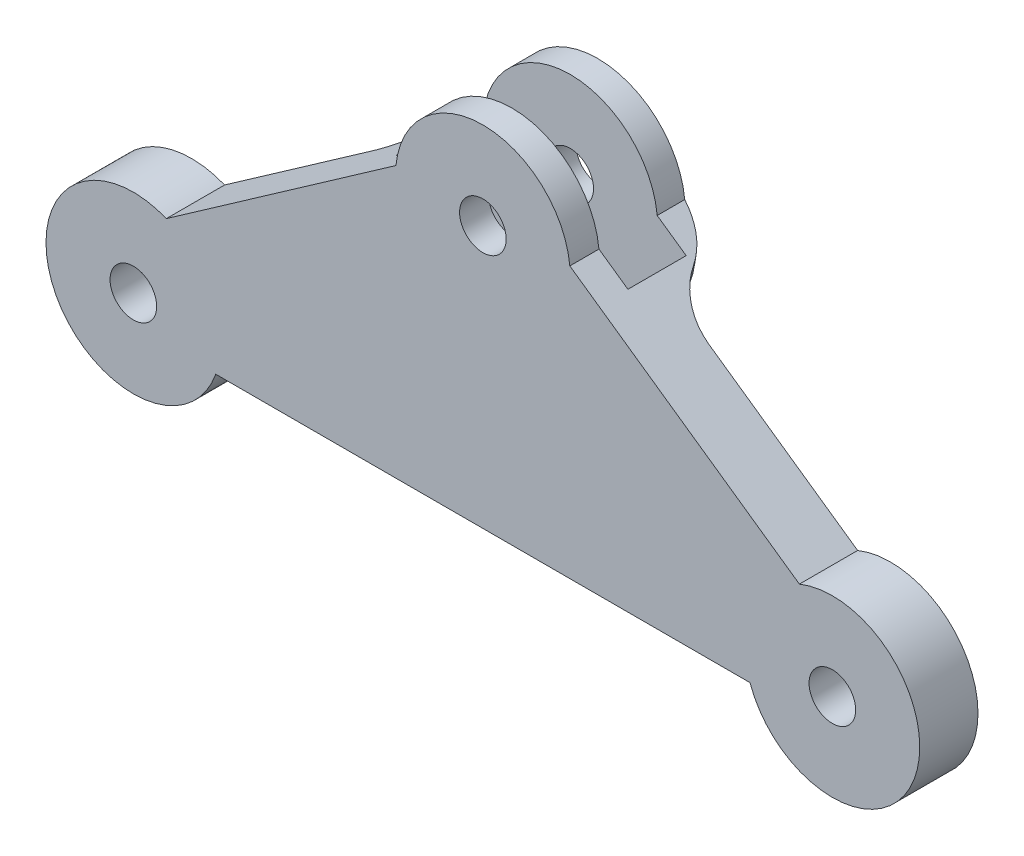
ISO-10303-21;
HEADER;
FILE_DESCRIPTION(('STEP AP214'),'2;1');
FILE_NAME('part.step','',(''),(''),'','','');
FILE_SCHEMA(('AUTOMOTIVE_DESIGN { 1 0 10303 214 1 1 1 1 }'));
ENDSEC;
DATA;
#1=APPLICATION_CONTEXT('core data for automotive mechanical design processes');
#2=APPLICATION_PROTOCOL_DEFINITION('international standard','automotive_design',2000,#1);
#3=PRODUCT_CONTEXT('',#1,'mechanical');
#4=PRODUCT('Part','Part','',(#3));
#5=PRODUCT_RELATED_PRODUCT_CATEGORY('part','',(#4));
#6=PRODUCT_DEFINITION_FORMATION('','',#4);
#7=PRODUCT_DEFINITION_CONTEXT('part definition',#1,'design');
#8=PRODUCT_DEFINITION('design','',#6,#7);
#9=PRODUCT_DEFINITION_SHAPE('','',#8);
#10=(LENGTH_UNIT() NAMED_UNIT(*) SI_UNIT(.MILLI.,.METRE.));
#11=(NAMED_UNIT(*) PLANE_ANGLE_UNIT() SI_UNIT($,.RADIAN.));
#12=(NAMED_UNIT(*) SI_UNIT($,.STERADIAN.) SOLID_ANGLE_UNIT());
#13=UNCERTAINTY_MEASURE_WITH_UNIT(LENGTH_MEASURE(1.E-05),#10,'distance_accuracy_value','');
#14=(GEOMETRIC_REPRESENTATION_CONTEXT(3) GLOBAL_UNCERTAINTY_ASSIGNED_CONTEXT((#13)) GLOBAL_UNIT_ASSIGNED_CONTEXT((#10,
#11,#12)) REPRESENTATION_CONTEXT('',''));
#15=CARTESIAN_POINT('',(0.,0.,0.));
#16=DIRECTION('',(0.,0.,1.));
#17=DIRECTION('',(1.,0.,0.));
#18=AXIS2_PLACEMENT_3D('',#15,#16,#17);
#19=CARTESIAN_POINT('',(60.0000001203415,29.2959686390319,17.627987333967));
#20=DIRECTION('',(0.,0.,-1.));
#21=DIRECTION('',(-1.00000000000001,0.,0.));
#22=AXIS2_PLACEMENT_3D('',#19,#20,#21);
#23=CYLINDRICAL_SURFACE('',#22,9.00000000000001);
#24=CARTESIAN_POINT('',(60.0000001203415,29.2959686390319,8.62798733396714));
#25=DIRECTION('',(0.,0.,1.));
#26=DIRECTION('',(1.00000000000001,0.,0.));
#27=AXIS2_PLACEMENT_3D('',#24,#25,#26);
#28=CIRCLE('',#27,9.00000000000001);
#29=CARTESIAN_POINT('',(68.9555880693523,30.1889661124638,8.62798733396714));
#30=VERTEX_POINT('',#29);
#31=CARTESIAN_POINT('',(51.044412171332,30.1889661124641,8.62798733396714));
#32=VERTEX_POINT('',#31);
#33=EDGE_CURVE('E135',#30,#32,#28,.T.);
#34=ORIENTED_EDGE('',*,*,#33,.F.);
#35=DIRECTION('',(0.,0.,-1.));
#36=VECTOR('',#35,1.);
#37=CARTESIAN_POINT('',(68.9555880693523,30.1889661124638,17.6279873339671));
#38=LINE('',#37,#36);
#39=CARTESIAN_POINT('',(68.9555880693523,30.1889661124638,5.79176533532464));
#40=VERTEX_POINT('',#39);
#41=EDGE_CURVE('E214',#30,#40,#38,.T.);
#42=ORIENTED_EDGE('',*,*,#41,.T.);
#43=CARTESIAN_POINT('',(60.0000001203414,29.2959686390319,5.79176533532464));
#44=DIRECTION('',(0.,0.,1.));
#45=DIRECTION('',(1.00000000000001,0.,0.));
#46=AXIS2_PLACEMENT_3D('',#43,#44,#45);
#47=CIRCLE('',#46,9.00000000000001);
#48=CARTESIAN_POINT('',(51.044412171332,30.1889661124641,5.79176533532463));
#49=VERTEX_POINT('',#48);
#50=EDGE_CURVE('E277',#40,#49,#47,.T.);
#51=ORIENTED_EDGE('',*,*,#50,.T.);
#52=DIRECTION('',(0.,0.,-1.));
#53=VECTOR('',#52,1.);
#54=CARTESIAN_POINT('',(51.044412171332,30.1889661124641,17.6279873339671));
#55=LINE('',#54,#53);
#56=EDGE_CURVE('E212',#32,#49,#55,.T.);
#57=ORIENTED_EDGE('',*,*,#56,.F.);
#58=EDGE_LOOP('',(#34,#42,#51,#57));
#59=FACE_BOUND('',#58,.T.);
#60=ADVANCED_FACE('F41',(#59),#23,.T.);
#61=CARTESIAN_POINT('',(60.0000001203415,29.2959686390319,17.627987333967));
#62=DIRECTION('',(0.,0.,-1.));
#63=DIRECTION('',(-1.00000000000001,0.,0.));
#64=AXIS2_PLACEMENT_3D('',#61,#62,#63);
#65=CYLINDRICAL_SURFACE('',#64,2.40000000000001);
#66=CARTESIAN_POINT('',(60.0000001203415,29.2959686390319,5.62798733396714));
#67=DIRECTION('',(0.,0.,1.));
#68=DIRECTION('',(1.00000000000001,0.,0.));
#69=AXIS2_PLACEMENT_3D('',#66,#67,#68);
#70=CIRCLE('',#69,2.40000000000001);
#71=CARTESIAN_POINT('',(62.4000001203415,29.2959686390319,5.62798733396714));
#72=VERTEX_POINT('',#71);
#73=EDGE_CURVE('E190',#72,#72,#70,.T.);
#74=ORIENTED_EDGE('',*,*,#73,.F.);
#75=EDGE_LOOP('',(#74));
#76=FACE_BOUND('',#75,.T.);
#77=CARTESIAN_POINT('',(60.0000001203415,29.2959686390319,8.62798733396714));
#78=DIRECTION('',(0.,0.,1.));
#79=DIRECTION('',(1.00000000000001,0.,0.));
#80=AXIS2_PLACEMENT_3D('',#77,#78,#79);
#81=CIRCLE('',#80,2.40000000000001);
#82=CARTESIAN_POINT('',(62.4000001203415,29.2959686390319,8.62798733396714));
#83=VERTEX_POINT('',#82);
#84=EDGE_CURVE('E285',#83,#83,#81,.T.);
#85=ORIENTED_EDGE('',*,*,#84,.T.);
#86=EDGE_LOOP('',(#85));
#87=FACE_BOUND('',#86,.T.);
#88=ADVANCED_FACE('F335',(#76,#87),#65,.F.);
#89=CARTESIAN_POINT('',(24.0000001203415,5.29596863903185,5.62798733396714));
#90=DIRECTION('',(0.,0.,1.));
#91=DIRECTION('',(1.00000000000001,0.,0.));
#92=AXIS2_PLACEMENT_3D('',#89,#90,#91);
#93=PLANE('',#92);
#94=CARTESIAN_POINT('',(60.0000001203414,29.2959686390319,5.62798733396714));
#95=DIRECTION('',(0.,0.,1.));
#96=DIRECTION('',(1.00000000000001,0.,0.));
#97=AXIS2_PLACEMENT_3D('',#94,#95,#96);
#98=CIRCLE('',#97,7.60769515458674);
#99=CARTESIAN_POINT('',(67.5387156989998,28.2738174812985,5.62798733396714));
#100=VERTEX_POINT('',#99);
#101=EDGE_CURVE('E63',#100,#100,#98,.F.);
#102=ORIENTED_EDGE('',*,*,#101,.T.);
#103=EDGE_LOOP('',(#102));
#104=FACE_BOUND('',#103,.T.);
#105=ORIENTED_EDGE('',*,*,#73,.T.);
#106=EDGE_LOOP('',(#105));
#107=FACE_BOUND('',#106,.T.);
#108=ADVANCED_FACE('F255',(#104,#107),#93,.F.);
#109=CARTESIAN_POINT('',(24.0000001203415,5.29596863903185,17.6279873339671));
#110=DIRECTION('',(0.,0.,-1.));
#111=DIRECTION('',(-1.00000000000001,0.,0.));
#112=AXIS2_PLACEMENT_3D('',#109,#110,#111);
#113=CYLINDRICAL_SURFACE('',#112,9.00000000000003);
#114=CARTESIAN_POINT('',(24.0000001203415,5.29596863903185,11.6279873339671));
#115=DIRECTION('',(0.,0.,-1.));
#116=DIRECTION('',(-1.00000000000001,0.,0.));
#117=AXIS2_PLACEMENT_3D('',#114,#115,#116);
#118=CIRCLE('',#117,9.00000000000003);
#119=CARTESIAN_POINT('',(32.4852814945787,2.29596863903166,11.6279873339671));
#120=VERTEX_POINT('',#119);
#121=CARTESIAN_POINT('',(27.3964483552936,13.6304835851628,11.6279873339671));
#122=VERTEX_POINT('',#121);
#123=EDGE_CURVE('E173',#120,#122,#118,.T.);
#124=ORIENTED_EDGE('',*,*,#123,.F.);
#125=DIRECTION('',(0.,0.,-1.));
#126=VECTOR('',#125,1.);
#127=CARTESIAN_POINT('',(32.4852814945787,2.29596863903166,17.627987333967));
#128=LINE('',#127,#126);
#129=CARTESIAN_POINT('',(32.4852814945787,2.29596863903166,17.627987333967));
#130=VERTEX_POINT('',#129);
#131=EDGE_CURVE('E224',#130,#120,#128,.T.);
#132=ORIENTED_EDGE('',*,*,#131,.F.);
#133=CARTESIAN_POINT('',(24.0000001203415,5.29596863903185,17.6279873339671));
#134=DIRECTION('',(0.,0.,1.));
#135=DIRECTION('',(1.00000000000001,0.,0.));
#136=AXIS2_PLACEMENT_3D('',#133,#134,#135);
#137=CIRCLE('',#136,9.00000000000003);
#138=CARTESIAN_POINT('',(27.3964483552936,13.6304835851628,17.627987333967));
#139=VERTEX_POINT('',#138);
#140=EDGE_CURVE('E194',#139,#130,#137,.T.);
#141=ORIENTED_EDGE('',*,*,#140,.F.);
#142=DIRECTION('',(0.,0.,-1.));
#143=VECTOR('',#142,1.);
#144=CARTESIAN_POINT('',(27.3964483552936,13.6304835851628,17.627987333967));
#145=LINE('',#144,#143);
#146=EDGE_CURVE('E209',#139,#122,#145,.T.);
#147=ORIENTED_EDGE('',*,*,#146,.T.);
#148=EDGE_LOOP('',(#124,#132,#141,#147));
#149=FACE_BOUND('',#148,.T.);
#150=ADVANCED_FACE('F250',(#149),#113,.T.);
#151=CARTESIAN_POINT('',(87.5147187461029,2.29596863903184,17.6279873339671));
#152=DIRECTION('',(0.,1.00000000000001,0.));
#153=DIRECTION('',(-1.00000000000001,0.,0.));
#154=AXIS2_PLACEMENT_3D('',#151,#152,#153);
#155=PLANE('',#154);
#156=DIRECTION('',(-1.00000000000001,0.,0.));
#157=VECTOR('',#156,1.);
#158=CARTESIAN_POINT('',(24.0000001203401,2.29596863903184,11.6279873339671));
#159=LINE('',#158,#157);
#160=CARTESIAN_POINT('',(87.5147187461029,2.29596863903184,11.6279873339671));
#161=VERTEX_POINT('',#160);
#162=EDGE_CURVE('E171',#161,#120,#159,.T.);
#163=ORIENTED_EDGE('',*,*,#162,.F.);
#164=DIRECTION('',(0.,0.,-1.));
#165=VECTOR('',#164,1.);
#166=CARTESIAN_POINT('',(87.5147187461029,2.29596863903184,17.6279873339671));
#167=LINE('',#166,#165);
#168=CARTESIAN_POINT('',(87.5147187461029,2.29596863903184,17.6279873339671));
#169=VERTEX_POINT('',#168);
#170=EDGE_CURVE('E221',#169,#161,#167,.T.);
#171=ORIENTED_EDGE('',*,*,#170,.F.);
#172=DIRECTION('',(1.00000000000001,0.,0.));
#173=VECTOR('',#172,1.);
#174=CARTESIAN_POINT('',(87.5147187461029,2.29596863903184,17.6279873339671));
#175=LINE('',#174,#173);
#176=EDGE_CURVE('E199',#130,#169,#175,.T.);
#177=ORIENTED_EDGE('',*,*,#176,.F.);
#178=ORIENTED_EDGE('',*,*,#131,.T.);
#179=EDGE_LOOP('',(#163,#171,#177,#178));
#180=FACE_BOUND('',#179,.T.);
#181=ADVANCED_FACE('F254',(#180),#155,.F.);
#182=CARTESIAN_POINT('',(96.0000001203428,5.29596863903161,17.627987333967));
#183=DIRECTION('',(0.,0.,-1.));
#184=DIRECTION('',(-1.00000000000001,0.,0.));
#185=AXIS2_PLACEMENT_3D('',#182,#183,#184);
#186=CYLINDRICAL_SURFACE('',#185,9.);
#187=CARTESIAN_POINT('',(96.0000001203428,5.29596863903161,11.6279873339671));
#188=DIRECTION('',(0.,0.,-1.));
#189=DIRECTION('',(-1.00000000000001,0.,0.));
#190=AXIS2_PLACEMENT_3D('',#187,#188,#189);
#191=CIRCLE('',#190,9.);
#192=CARTESIAN_POINT('',(92.6035518853908,13.6304835851635,11.6279873339671));
#193=VERTEX_POINT('',#192);
#194=EDGE_CURVE('E169',#193,#161,#191,.T.);
#195=ORIENTED_EDGE('',*,*,#194,.F.);
#196=DIRECTION('',(0.,0.,-1.));
#197=VECTOR('',#196,1.);
#198=CARTESIAN_POINT('',(92.6035518853908,13.6304835851635,17.6279873339671));
#199=LINE('',#198,#197);
#200=CARTESIAN_POINT('',(92.6035518853908,13.6304835851635,17.6279873339671));
#201=VERTEX_POINT('',#200);
#202=EDGE_CURVE('E218',#201,#193,#199,.T.);
#203=ORIENTED_EDGE('',*,*,#202,.F.);
#204=CARTESIAN_POINT('',(96.0000001203428,5.29596863903161,17.627987333967));
#205=DIRECTION('',(0.,0.,1.));
#206=DIRECTION('',(1.00000000000001,0.,0.));
#207=AXIS2_PLACEMENT_3D('',#204,#205,#206);
#208=CIRCLE('',#207,9.);
#209=EDGE_CURVE('E201',#169,#201,#208,.T.);
#210=ORIENTED_EDGE('',*,*,#209,.F.);
#211=ORIENTED_EDGE('',*,*,#170,.T.);
#212=EDGE_LOOP('',(#195,#203,#210,#211));
#213=FACE_BOUND('',#212,.T.);
#214=ADVANCED_FACE('F259',(#213),#186,.T.);
#215=CARTESIAN_POINT('',(68.9555880693523,30.1889661124638,17.6279873339671));
#216=DIRECTION('',(-0.573576436351047,-0.819152044289004,0.));
#217=DIRECTION('',(0.819152044289004,-0.573576436351047,0.));
#218=AXIS2_PLACEMENT_3D('',#215,#216,#217);
#219=PLANE('',#218);
#220=DIRECTION('',(0.,0.,-1.));
#221=VECTOR('',#220,1.);
#222=CARTESIAN_POINT('',(71.940167765287,28.0991409109832,14.6279873339672));
#223=LINE('',#222,#221);
#224=CARTESIAN_POINT('',(71.940167765287,28.0991409109832,14.6279873339672));
#225=VERTEX_POINT('',#224);
#226=CARTESIAN_POINT('',(71.940167765287,28.0991409109832,8.62798733396714));
#227=VERTEX_POINT('',#226);
#228=EDGE_CURVE('E145',#225,#227,#223,.T.);
#229=ORIENTED_EDGE('',*,*,#228,.F.);
#230=DIRECTION('',(-0.819152044289004,0.573576436351047,0.));
#231=VECTOR('',#230,1.);
#232=CARTESIAN_POINT('',(68.9555880693523,30.1889661124638,14.6279873339671));
#233=LINE('',#232,#231);
#234=CARTESIAN_POINT('',(68.9555880693523,30.1889661124638,14.6279873339671));
#235=VERTEX_POINT('',#234);
#236=EDGE_CURVE('E157',#225,#235,#233,.T.);
#237=ORIENTED_EDGE('',*,*,#236,.T.);
#238=CARTESIAN_POINT('',(68.9555880693523,30.1889661124638,17.6279873339671));
#239=VERTEX_POINT('',#238);
#240=EDGE_CURVE('E215',#239,#235,#38,.T.);
#241=ORIENTED_EDGE('',*,*,#240,.F.);
#242=DIRECTION('',(-0.819152044289004,0.573576436351047,0.));
#243=VECTOR('',#242,1.);
#244=CARTESIAN_POINT('',(68.9555880693523,30.1889661124638,17.6279873339671));
#245=LINE('',#244,#243);
#246=EDGE_CURVE('E203',#201,#239,#245,.T.);
#247=ORIENTED_EDGE('',*,*,#246,.F.);
#248=ORIENTED_EDGE('',*,*,#202,.T.);
#249=DIRECTION('',(0.819152044289004,-0.573576436351047,0.));
#250=VECTOR('',#249,1.);
#251=CARTESIAN_POINT('',(50.4858187955546,43.1216377869705,11.6279873339671));
#252=LINE('',#251,#250);
#253=CARTESIAN_POINT('',(77.305037631998,24.3426185887962,11.6279873339671));
#254=VERTEX_POINT('',#253);
#255=EDGE_CURVE('E167',#254,#193,#252,.T.);
#256=ORIENTED_EDGE('',*,*,#255,.F.);
#257=CARTESIAN_POINT('',(77.305037631998,24.3426185887962,11.6279873339671));
#258=CARTESIAN_POINT('',(77.1473189185694,24.4530544208565,11.6280026341653));
#259=CARTESIAN_POINT('',(76.9896141462791,24.5634804912262,11.6197053384037));
#260=CARTESIAN_POINT('',(76.6753775709217,24.7835113100729,11.5867834803586));
#261=CARTESIAN_POINT('',(76.5188455708564,24.8931161964895,11.5621617253414));
#262=CARTESIAN_POINT('',(76.2081446238197,25.1106713417335,11.4969096768588));
#263=CARTESIAN_POINT('',(76.0539742210951,25.2186226198901,11.4562896946914));
#264=CARTESIAN_POINT('',(75.7489589525765,25.4321966101759,11.3594263691947));
#265=CARTESIAN_POINT('',(75.5981141916181,25.5378192488984,11.3031825341059));
#266=CARTESIAN_POINT('',(75.3008466297085,25.7459682366127,11.1755304440831));
#267=CARTESIAN_POINT('',(75.154422471696,25.8484955358291,11.1041268981581));
#268=CARTESIAN_POINT('',(74.8669195402621,26.0498072556765,10.9466031108625));
#269=CARTESIAN_POINT('',(74.7258427659343,26.1485902765271,10.8604774307134));
#270=CARTESIAN_POINT('',(74.4501292535619,26.3416469562766,10.6740671666632));
#271=CARTESIAN_POINT('',(74.315491809934,26.4359211092302,10.57378413882));
#272=CARTESIAN_POINT('',(74.0536286961268,26.6192796354968,10.3595865328542));
#273=CARTESIAN_POINT('',(73.926405546322,26.7083622440247,10.2456673590613));
#274=CARTESIAN_POINT('',(73.6803469828215,26.8806543050288,10.0047130284411));
#275=CARTESIAN_POINT('',(73.5615208906493,26.963857230504,9.87766366935278));
#276=CARTESIAN_POINT('',(73.3335114393007,27.1235111671216,9.61123361040114));
#277=CARTESIAN_POINT('',(73.2243285822874,27.1999618266455,9.47185226911593));
#278=CARTESIAN_POINT('',(73.0167480434002,27.3453112847599,9.18151207236016));
#279=CARTESIAN_POINT('',(72.9183531568986,27.4142081260095,9.03055023330051));
#280=CARTESIAN_POINT('',(72.7336466580785,27.5435410088399,8.71808409784857));
#281=CARTESIAN_POINT('',(72.6473283053338,27.6039817701177,8.55658575673335));
#282=CARTESIAN_POINT('',(72.4934891528788,27.7117011043385,8.23562610211877));
#283=CARTESIAN_POINT('',(72.4250801530635,27.7596016016903,8.07679943329057));
#284=CARTESIAN_POINT('',(72.3007853076722,27.8466337893938,7.75209313792371));
#285=CARTESIAN_POINT('',(72.2448920970444,27.8857706368103,7.58621772803634));
#286=CARTESIAN_POINT('',(72.1466149000357,27.9545850709898,7.24898464670327));
#287=CARTESIAN_POINT('',(72.104203020955,27.9842821884317,7.07763911243106));
#288=CARTESIAN_POINT('',(72.0335427909504,28.0337590141327,6.73073676962939));
#289=CARTESIAN_POINT('',(72.0052849385815,28.0535453753753,6.55518286930532));
#290=CARTESIAN_POINT('',(71.969684588738,28.0784730086985,6.25408401521821));
#291=CARTESIAN_POINT('',(71.9586223839462,28.0862188478827,6.12917767628016));
#292=CARTESIAN_POINT('',(71.9438623360783,28.0965539446641,5.87885029644695));
#293=CARTESIAN_POINT('',(71.9401568087896,28.0991485828048,5.7534299298727));
#294=CARTESIAN_POINT('',(71.940167765287,28.0991409109832,5.62798733396714));
#295=B_SPLINE_CURVE_WITH_KNOTS('',3,(#257,#258,#259,#260,#261,#262,#263,#264,#265,#266,#267,
#268,#269,#270,#271,#272,#273,#274,#275,#276,#277,#278,#279,#280,#281,#282,#283,#284,#285,#286,
#287,#288,#289,#290,#291,#292,#293,#294),.UNSPECIFIED.,.F.,.F.,(4,2,2,2,2,2,2,2,2,2,2,2,2,2,2,2,
2,2,4),(0.,0.577413915635828,1.15472856094592,1.73167171839797,2.30863303715225,
2.88541539791888,3.46241130096261,4.0393438347198,4.61647135734079,5.19422979629283,
5.77201830380988,6.34995617545358,6.92757017747422,7.46514938305384,8.0024114080908,
8.5385544984264,9.07433719773808,9.45093481998273,9.82713887027634),.UNSPECIFIED.);
#296=CARTESIAN_POINT('',(72.6877541951725,27.5756752573129,8.62798733396821));
#297=VERTEX_POINT('',#296);
#298=EDGE_CURVE('E235',#254,#297,#295,.T.);
#299=ORIENTED_EDGE('',*,*,#298,.T.);
#300=CARTESIAN_POINT('',(72.6877541951719,27.5756752573133,8.62798733396714));
#301=CARTESIAN_POINT('',(72.6098656248375,27.6302134214023,8.48155684356566));
#302=CARTESIAN_POINT('',(72.5264619501092,27.6886133031616,8.33954447407848));
#303=CARTESIAN_POINT('',(72.3496316380337,27.812431220661,8.06527987605757));
#304=CARTESIAN_POINT('',(72.2562112113275,27.8778449076633,7.93302168457529));
#305=CARTESIAN_POINT('',(72.0613341665958,28.0142992834085,7.68040402139208));
#306=CARTESIAN_POINT('',(71.9599772668469,28.0852701486624,7.5599296524956));
#307=CARTESIAN_POINT('',(71.7493110248038,28.232780239387,7.32981873639077));
#308=CARTESIAN_POINT('',(71.6400008195115,28.3093200691354,7.22018336835561));
#309=CARTESIAN_POINT('',(71.4146669581169,28.4671005374979,7.01239960610541));
#310=CARTESIAN_POINT('',(71.2986582241317,28.5483307275329,6.9142270478922));
#311=CARTESIAN_POINT('',(71.0606436666988,28.7149903148514,6.72928305035579));
#312=CARTESIAN_POINT('',(70.9386354762575,28.8004213695216,6.64251616136779));
#313=CARTESIAN_POINT('',(70.6889482977724,28.9752542140911,6.48004492352967));
#314=CARTESIAN_POINT('',(70.5612425940738,29.0646747104932,6.40440188347744));
#315=CARTESIAN_POINT('',(70.3016724409362,29.2464276884144,6.26459421582898));
#316=CARTESIAN_POINT('',(70.1698070845634,29.3387608049755,6.20043211206796));
#317=CARTESIAN_POINT('',(69.8441720131589,29.5667729366783,6.05761612264956));
#318=CARTESIAN_POINT('',(69.6486261361816,29.7036956338036,5.98495534150494));
#319=CARTESIAN_POINT('',(69.2528339683018,29.9808322933174,5.86140540258454));
#320=CARTESIAN_POINT('',(69.0525827979033,30.1210496723657,5.81054000255751));
#321=CARTESIAN_POINT('',(68.6511899485618,30.4021079712582,5.7290249597819));
#322=CARTESIAN_POINT('',(68.4500717086004,30.5429324789506,5.69820094183338));
#323=CARTESIAN_POINT('',(68.1477607610062,30.7546128833393,5.66476383213115));
#324=CARTESIAN_POINT('',(68.0470012037439,30.8251654848811,5.65575432016717));
#325=CARTESIAN_POINT('',(67.8453235693228,30.9663816847911,5.64161115799841));
#326=CARTESIAN_POINT('',(67.7444055384268,31.0370452507658,5.63647653318164));
#327=CARTESIAN_POINT('',(67.6434471227443,31.1077370944727,5.63309602422894));
#328=B_SPLINE_CURVE_WITH_KNOTS('',3,(#300,#301,#302,#303,#304,#305,#306,#307,#308,#309,#310,
#311,#312,#313,#314,#315,#316,#317,#318,#319,#320,#321,#322,#323,#324,#325,#326,#327),
.UNSPECIFIED.,.F.,.F.,(4,2,2,2,2,2,2,2,2,2,2,2,2,4),(0.,0.523541553996869,1.0467603557347,
1.56422290552886,2.08174168818843,2.59814903661749,3.11476178646349,3.63412293222252,
4.15359810839443,4.9009938703386,5.64920226075124,6.39081032369599,6.76076355624513,
7.13062370708141),.UNSPECIFIED.);
#329=EDGE_CURVE('E270',#297,#40,#328,.T.);
#330=ORIENTED_EDGE('',*,*,#329,.T.);
#331=ORIENTED_EDGE('',*,*,#41,.F.);
#332=DIRECTION('',(-0.819152044289004,0.573576436351047,0.));
#333=VECTOR('',#332,1.);
#334=CARTESIAN_POINT('',(68.9555880693523,30.1889661124638,8.62798733396714));
#335=LINE('',#334,#333);
#336=EDGE_CURVE('E57',#227,#30,#335,.T.);
#337=ORIENTED_EDGE('',*,*,#336,.F.);
#338=EDGE_LOOP('',(#229,#237,#241,#247,#248,#256,#299,#330,#331,#337));
#339=FACE_BOUND('',#338,.T.);
#340=ADVANCED_FACE('F262',(#339),#219,.F.);
#341=CARTESIAN_POINT('',(27.3964483552936,13.6304835851628,17.627987333967));
#342=DIRECTION('',(0.573576436351047,-0.819152044288996,0.));
#343=DIRECTION('',(0.819152044288996,0.573576436351047,0.));
#344=AXIS2_PLACEMENT_3D('',#341,#342,#343);
#345=PLANE('',#344);
#346=CARTESIAN_POINT('',(51.044412171332,30.1889661124641,17.6279873339671));
#347=VERTEX_POINT('',#346);
#348=CARTESIAN_POINT('',(51.044412171332,30.1889661124641,14.6279873339671));
#349=VERTEX_POINT('',#348);
#350=EDGE_CURVE('E154',#347,#349,#55,.T.);
#351=ORIENTED_EDGE('',*,*,#350,.T.);
#352=DIRECTION('',(-0.819152044288996,-0.573576436351047,0.));
#353=VECTOR('',#352,1.);
#354=CARTESIAN_POINT('',(27.3964483552936,13.6304835851628,14.6279873339671));
#355=LINE('',#354,#353);
#356=CARTESIAN_POINT('',(48.0598324753972,28.0991409109829,14.6279873339671));
#357=VERTEX_POINT('',#356);
#358=EDGE_CURVE('E151',#349,#357,#355,.T.);
#359=ORIENTED_EDGE('',*,*,#358,.T.);
#360=DIRECTION('',(0.,0.,-1.));
#361=VECTOR('',#360,1.);
#362=CARTESIAN_POINT('',(48.0598324753972,28.0991409109829,14.6279873339671));
#363=LINE('',#362,#361);
#364=CARTESIAN_POINT('',(48.0598324753972,28.0991409109829,8.62798733396714));
#365=VERTEX_POINT('',#364);
#366=EDGE_CURVE('E11',#365,#357,#363,.F.);
#367=ORIENTED_EDGE('',*,*,#366,.F.);
#368=DIRECTION('',(-0.819152044288996,-0.573576436351047,0.));
#369=VECTOR('',#368,1.);
#370=CARTESIAN_POINT('',(27.3964483552936,13.6304835851628,8.62798733396714));
#371=LINE('',#370,#369);
#372=EDGE_CURVE('E131',#32,#365,#371,.T.);
#373=ORIENTED_EDGE('',*,*,#372,.F.);
#374=ORIENTED_EDGE('',*,*,#56,.T.);
#375=CARTESIAN_POINT('',(51.044412171332,30.1889661124641,5.79176533532463));
#376=CARTESIAN_POINT('',(50.8896645261532,30.0806106447891,5.82590385305225));
#377=CARTESIAN_POINT('',(50.7357500426305,29.9728385631866,5.86609777685757));
#378=CARTESIAN_POINT('',(50.4304024803876,29.7590318983302,5.95938479982502));
#379=CARTESIAN_POINT('',(50.2789722181042,29.6529992871664,6.01249158721997));
#380=CARTESIAN_POINT('',(49.9788395892842,29.4428441580037,6.13268450172934));
#381=CARTESIAN_POINT('',(49.830159181182,29.3387370154661,6.19985300227969));
#382=CARTESIAN_POINT('',(49.5376902062331,29.1339480345153,6.34841549064887));
#383=CARTESIAN_POINT('',(49.393899783261,29.0332648964292,6.42980400722484));
#384=CARTESIAN_POINT('',(49.1243710610075,28.8445388533431,6.59952154371431));
#385=CARTESIAN_POINT('',(48.9981364643823,28.7561484372022,6.68667504046346));
#386=CARTESIAN_POINT('',(48.7517495699292,28.5836264763892,6.87311004125629));
#387=CARTESIAN_POINT('',(48.6315993424928,28.4994963814209,6.97239563490931));
#388=CARTESIAN_POINT('',(48.3989540299934,28.3365963798798,7.1824322528903));
#389=CARTESIAN_POINT('',(48.2864301993007,28.2578063454004,7.29313573998185));
#390=CARTESIAN_POINT('',(48.0696173182399,28.1059923317009,7.52586673076255));
#391=CARTESIAN_POINT('',(47.9653243157416,28.0329655851697,7.64788873774485));
#392=CARTESIAN_POINT('',(47.7657369625083,27.8932130159044,7.90296433150173));
#393=CARTESIAN_POINT('',(47.6704623230342,27.8265009951439,8.03604094092434));
#394=CARTESIAN_POINT('',(47.4901734444802,27.7002613633246,8.3121711506576));
#395=CARTESIAN_POINT('',(47.4051583343597,27.6407331423566,8.45522390235781));
#396=CARTESIAN_POINT('',(47.2455517904143,27.5289754371386,8.75175393849379));
#397=CARTESIAN_POINT('',(47.1710692852744,27.4768222255749,8.90531876694409));
#398=CARTESIAN_POINT('',(47.0343211691109,27.3810701638011,9.22045589913167));
#399=CARTESIAN_POINT('',(46.9720624096342,27.3374761110958,9.38203263044274));
#400=CARTESIAN_POINT('',(46.9163609539661,27.2984735319475,9.54694688050046));
#401=B_SPLINE_CURVE_WITH_KNOTS('',3,(#375,#376,#377,#378,#379,#380,#381,#382,#383,#384,#385,
#386,#387,#388,#389,#390,#391,#392,#393,#394,#395,#396,#397,#398,#399,#400),.UNSPECIFIED.,.F.,
.F.,(4,2,2,2,2,2,2,2,2,2,2,2,4),(0.,0.575931645247693,1.15247648690013,1.73249828416478,
2.31229740378641,2.84288204670906,3.37364604041419,3.90228321425518,4.43066499247896,
4.96017619446248,5.48964240892403,6.02423654879309,6.55912948456854),.UNSPECIFIED.);
#402=CARTESIAN_POINT('',(47.3122460455126,27.5756752573135,8.62798733396663));
#403=VERTEX_POINT('',#402);
#404=EDGE_CURVE('E50',#49,#403,#401,.T.);
#405=ORIENTED_EDGE('',*,*,#404,.T.);
#406=CARTESIAN_POINT('',(48.0598324753972,28.0991409109829,5.62798733396714));
#407=CARTESIAN_POINT('',(48.0598643311526,28.0991632166224,5.7834964975245));
#408=CARTESIAN_POINT('',(48.0541562070267,28.0951663450803,5.93899003591143));
#409=CARTESIAN_POINT('',(48.0314988252974,28.0793014755972,6.24868440619588));
#410=CARTESIAN_POINT('',(48.0145545863038,28.0674369917247,6.4028857841135));
#411=CARTESIAN_POINT('',(47.9697719157688,28.0360798282349,6.70813572597669));
#412=CARTESIAN_POINT('',(47.941986544525,28.0166243018378,6.85919592759002));
#413=CARTESIAN_POINT('',(47.8759433042057,27.9703803271189,7.15786633188309));
#414=CARTESIAN_POINT('',(47.8376846699808,27.9435913430336,7.30547628164084));
#415=CARTESIAN_POINT('',(47.7512881552286,27.883095852129,7.59603604942187));
#416=CARTESIAN_POINT('',(47.7031672080099,27.8494012021402,7.73899337471664));
#417=CARTESIAN_POINT('',(47.5976026556139,27.7754841067843,8.01970395528658));
#418=CARTESIAN_POINT('',(47.5401555150638,27.7352591859226,8.15745521253718));
#419=CARTESIAN_POINT('',(47.3546733502548,27.6053831759203,8.56195596245871));
#420=CARTESIAN_POINT('',(47.2135095347044,27.5065392081498,8.81991291685088));
#421=CARTESIAN_POINT('',(46.8913010958242,27.2809264303709,9.32328231442065));
#422=CARTESIAN_POINT('',(46.7082467775358,27.1527504168031,9.56675959895578));
#423=CARTESIAN_POINT('',(46.3142953951957,26.8769026892005,10.0174362015542));
#424=CARTESIAN_POINT('',(46.1033893700047,26.7292247005086,10.2246237934772));
#425=CARTESIAN_POINT('',(45.6343321516329,26.4007873003532,10.6203100992064));
#426=CARTESIAN_POINT('',(45.3735351432539,26.2181752691431,10.8041441112866));
#427=CARTESIAN_POINT('',(44.8313853020688,25.8385578635054,11.1189330310103));
#428=CARTESIAN_POINT('',(44.5500322105363,25.6415523079156,11.2498872729547));
#429=CARTESIAN_POINT('',(44.007745948398,25.261839379299,11.4435105558955));
#430=CARTESIAN_POINT('',(43.7483042867765,25.0801763721062,11.5124003825179));
#431=CARTESIAN_POINT('',(43.3553242772202,24.8050088070493,11.5815778539956));
#432=CARTESIAN_POINT('',(43.2236835438181,24.7128329731856,11.5989441566074));
#433=CARTESIAN_POINT('',(42.9596982782955,24.5279885002905,11.6221495596447));
#434=CARTESIAN_POINT('',(42.8273536196196,24.435319772644,11.6279865118313));
#435=CARTESIAN_POINT('',(42.694962608685,24.3426185887969,11.6279873339671));
#436=B_SPLINE_CURVE_WITH_KNOTS('',3,(#406,#407,#408,#409,#410,#411,#412,#413,#414,#415,#416,
#417,#418,#419,#420,#421,#422,#423,#424,#425,#426,#427,#428,#429,#430,#431,#432,#433,#434,#435),
.UNSPECIFIED.,.F.,.F.,(4,2,2,2,2,2,2,2,2,2,2,2,2,2,4),(0.,0.466346863204242,0.932485572783727,
1.3963708908928,1.86029010831158,2.32341936427285,2.78672459496213,3.71345999150688,
4.70103231220332,5.68892315676311,6.78704120646115,7.88517307984982,8.85412035188085,
9.33867486150538,9.82331964860855),.UNSPECIFIED.);
#437=CARTESIAN_POINT('',(42.694962608685,24.3426185887969,11.6279873339671));
#438=VERTEX_POINT('',#437);
#439=EDGE_CURVE('E229',#403,#438,#436,.T.);
#440=ORIENTED_EDGE('',*,*,#439,.T.);
#441=DIRECTION('',(0.819152044288996,0.573576436351047,0.));
#442=VECTOR('',#441,1.);
#443=CARTESIAN_POINT('',(21.2014562854044,9.29270343867764,11.6279873339671));
#444=LINE('',#443,#442);
#445=EDGE_CURVE('E175',#122,#438,#444,.T.);
#446=ORIENTED_EDGE('',*,*,#445,.F.);
#447=ORIENTED_EDGE('',*,*,#146,.F.);
#448=DIRECTION('',(-0.819152044288996,-0.573576436351047,0.));
#449=VECTOR('',#448,1.);
#450=CARTESIAN_POINT('',(27.3964483552936,13.6304835851628,17.627987333967));
#451=LINE('',#450,#449);
#452=EDGE_CURVE('E207',#347,#139,#451,.T.);
#453=ORIENTED_EDGE('',*,*,#452,.F.);
#454=EDGE_LOOP('',(#351,#359,#367,#373,#374,#405,#440,#446,#447,#453));
#455=FACE_BOUND('',#454,.T.);
#456=ADVANCED_FACE('F150',(#455),#345,.F.);
#457=CARTESIAN_POINT('',(96.0000001203428,5.29596863903161,17.627987333967));
#458=DIRECTION('',(0.,0.,-1.));
#459=DIRECTION('',(-1.00000000000001,0.,0.));
#460=AXIS2_PLACEMENT_3D('',#457,#458,#459);
#461=CYLINDRICAL_SURFACE('',#460,2.4);
#462=CARTESIAN_POINT('',(96.0000001203428,5.29596863903161,17.627987333967));
#463=DIRECTION('',(0.,0.,1.));
#464=DIRECTION('',(1.00000000000001,0.,0.));
#465=AXIS2_PLACEMENT_3D('',#462,#463,#464);
#466=CIRCLE('',#465,2.4);
#467=CARTESIAN_POINT('',(98.4000001203428,5.29596863903161,17.627987333967));
#468=VERTEX_POINT('',#467);
#469=EDGE_CURVE('E187',#468,#468,#466,.T.);
#470=ORIENTED_EDGE('',*,*,#469,.T.);
#471=EDGE_LOOP('',(#470));
#472=FACE_BOUND('',#471,.T.);
#473=CARTESIAN_POINT('',(96.0000001203428,5.29596863903161,11.6279873339671));
#474=DIRECTION('',(0.,0.,-1.));
#475=DIRECTION('',(-1.00000000000001,0.,0.));
#476=AXIS2_PLACEMENT_3D('',#473,#474,#475);
#477=CIRCLE('',#476,2.4);
#478=CARTESIAN_POINT('',(93.6000001203428,5.29596863903161,11.6279873339671));
#479=VERTEX_POINT('',#478);
#480=EDGE_CURVE('E181',#479,#479,#477,.F.);
#481=ORIENTED_EDGE('',*,*,#480,.F.);
#482=EDGE_LOOP('',(#481));
#483=FACE_BOUND('',#482,.T.);
#484=ADVANCED_FACE('F354',(#472,#483),#461,.F.);
#485=CARTESIAN_POINT('',(24.0000001203415,5.29596863903185,17.6279873339671));
#486=DIRECTION('',(0.,0.,-1.));
#487=DIRECTION('',(-1.00000000000001,0.,0.));
#488=AXIS2_PLACEMENT_3D('',#485,#486,#487);
#489=CYLINDRICAL_SURFACE('',#488,2.4);
#490=CARTESIAN_POINT('',(24.0000001203415,5.29596863903185,17.6279873339671));
#491=DIRECTION('',(0.,0.,1.));
#492=DIRECTION('',(1.00000000000001,0.,0.));
#493=AXIS2_PLACEMENT_3D('',#490,#491,#492);
#494=CIRCLE('',#493,2.4);
#495=CARTESIAN_POINT('',(26.4000001203415,5.29596863903185,17.6279873339671));
#496=VERTEX_POINT('',#495);
#497=EDGE_CURVE('E184',#496,#496,#494,.T.);
#498=ORIENTED_EDGE('',*,*,#497,.T.);
#499=EDGE_LOOP('',(#498));
#500=FACE_BOUND('',#499,.T.);
#501=CARTESIAN_POINT('',(24.0000001203415,5.29596863903185,11.6279873339671));
#502=DIRECTION('',(0.,0.,-1.));
#503=DIRECTION('',(-1.00000000000001,0.,0.));
#504=AXIS2_PLACEMENT_3D('',#501,#502,#503);
#505=CIRCLE('',#504,2.4);
#506=CARTESIAN_POINT('',(21.6000001203414,5.29596863903185,11.6279873339671));
#507=VERTEX_POINT('',#506);
#508=EDGE_CURVE('E178',#507,#507,#505,.F.);
#509=ORIENTED_EDGE('',*,*,#508,.F.);
#510=EDGE_LOOP('',(#509));
#511=FACE_BOUND('',#510,.T.);
#512=ADVANCED_FACE('F348',(#500,#511),#489,.F.);
#513=CARTESIAN_POINT('',(24.0000001203415,5.29596863903185,17.6279873339671));
#514=DIRECTION('',(0.,0.,1.));
#515=DIRECTION('',(1.00000000000001,0.,0.));
#516=AXIS2_PLACEMENT_3D('',#513,#514,#515);
#517=PLANE('',#516);
#518=ORIENTED_EDGE('',*,*,#469,.F.);
#519=EDGE_LOOP('',(#518));
#520=FACE_BOUND('',#519,.T.);
#521=ORIENTED_EDGE('',*,*,#140,.T.);
#522=ORIENTED_EDGE('',*,*,#176,.T.);
#523=ORIENTED_EDGE('',*,*,#209,.T.);
#524=ORIENTED_EDGE('',*,*,#246,.T.);
#525=CARTESIAN_POINT('',(60.0000001203415,29.2959686390319,17.627987333967));
#526=DIRECTION('',(0.,0.,1.));
#527=DIRECTION('',(1.00000000000001,0.,0.));
#528=AXIS2_PLACEMENT_3D('',#525,#526,#527);
#529=CIRCLE('',#528,9.00000000000001);
#530=EDGE_CURVE('E205',#239,#347,#529,.T.);
#531=ORIENTED_EDGE('',*,*,#530,.T.);
#532=ORIENTED_EDGE('',*,*,#452,.T.);
#533=EDGE_LOOP('',(#521,#522,#523,#524,#531,#532));
#534=FACE_BOUND('',#533,.T.);
#535=CARTESIAN_POINT('',(60.0000001203415,29.2959686390319,17.627987333967));
#536=DIRECTION('',(0.,0.,1.));
#537=DIRECTION('',(1.00000000000001,0.,0.));
#538=AXIS2_PLACEMENT_3D('',#535,#536,#537);
#539=CIRCLE('',#538,2.40000000000001);
#540=CARTESIAN_POINT('',(62.4000001203415,29.2959686390319,17.627987333967));
#541=VERTEX_POINT('',#540);
#542=EDGE_CURVE('E191',#541,#541,#539,.T.);
#543=ORIENTED_EDGE('',*,*,#542,.F.);
#544=EDGE_LOOP('',(#543));
#545=FACE_BOUND('',#544,.T.);
#546=ORIENTED_EDGE('',*,*,#497,.F.);
#547=EDGE_LOOP('',(#546));
#548=FACE_BOUND('',#547,.T.);
#549=ADVANCED_FACE('F320',(#520,#534,#545,#548),#517,.T.);
#550=ORIENTED_EDGE('',*,*,#240,.T.);
#551=CARTESIAN_POINT('',(60.0000001203415,29.2959686390319,14.6279873339671));
#552=DIRECTION('',(0.,0.,1.));
#553=DIRECTION('',(1.00000000000001,0.,0.));
#554=AXIS2_PLACEMENT_3D('',#551,#552,#553);
#555=CIRCLE('',#554,9.00000000000001);
#556=EDGE_CURVE('E158',#235,#349,#555,.T.);
#557=ORIENTED_EDGE('',*,*,#556,.T.);
#558=ORIENTED_EDGE('',*,*,#350,.F.);
#559=ORIENTED_EDGE('',*,*,#530,.F.);
#560=EDGE_LOOP('',(#550,#557,#558,#559));
#561=FACE_BOUND('',#560,.T.);
#562=ADVANCED_FACE('F267',(#561),#23,.T.);
#563=CARTESIAN_POINT('',(60.0000001203415,29.2959686390319,14.6279873339671));
#564=DIRECTION('',(0.,0.,1.));
#565=DIRECTION('',(1.00000000000001,0.,0.));
#566=AXIS2_PLACEMENT_3D('',#563,#564,#565);
#567=CIRCLE('',#566,2.40000000000001);
#568=CARTESIAN_POINT('',(62.4000001203415,29.2959686390319,14.6279873339671));
#569=VERTEX_POINT('',#568);
#570=EDGE_CURVE('E162',#569,#569,#567,.T.);
#571=ORIENTED_EDGE('',*,*,#570,.F.);
#572=EDGE_LOOP('',(#571));
#573=FACE_BOUND('',#572,.T.);
#574=ORIENTED_EDGE('',*,*,#542,.T.);
#575=EDGE_LOOP('',(#574));
#576=FACE_BOUND('',#575,.T.);
#577=ADVANCED_FACE('F341',(#573,#576),#65,.F.);
#578=CARTESIAN_POINT('',(24.0000001203415,5.29596863903185,11.6279873339671));
#579=DIRECTION('',(0.,0.,-1.));
#580=DIRECTION('',(-1.00000000000001,0.,0.));
#581=AXIS2_PLACEMENT_3D('',#578,#579,#580);
#582=PLANE('',#581);
#583=ORIENTED_EDGE('',*,*,#445,.T.);
#584=CARTESIAN_POINT('',(60.0000001203414,29.2959686390319,11.6279873339671));
#585=DIRECTION('',(0.,0.,-1.));
#586=DIRECTION('',(-1.00000000000001,0.,0.));
#587=AXIS2_PLACEMENT_3D('',#584,#585,#586);
#588=CIRCLE('',#587,18.);
#589=EDGE_CURVE('E227',#438,#254,#588,.F.);
#590=ORIENTED_EDGE('',*,*,#589,.T.);
#591=ORIENTED_EDGE('',*,*,#255,.T.);
#592=ORIENTED_EDGE('',*,*,#194,.T.);
#593=ORIENTED_EDGE('',*,*,#162,.T.);
#594=ORIENTED_EDGE('',*,*,#123,.T.);
#595=EDGE_LOOP('',(#583,#590,#591,#592,#593,#594));
#596=FACE_BOUND('',#595,.T.);
#597=ORIENTED_EDGE('',*,*,#508,.T.);
#598=EDGE_LOOP('',(#597));
#599=FACE_BOUND('',#598,.T.);
#600=ORIENTED_EDGE('',*,*,#480,.T.);
#601=EDGE_LOOP('',(#600));
#602=FACE_BOUND('',#601,.T.);
#603=ADVANCED_FACE('F248',(#596,#599,#602),#582,.T.);
#604=CARTESIAN_POINT('',(60.0000001203414,29.2959686390319,5.62798733396714));
#605=DIRECTION('',(0.,0.,-1.));
#606=DIRECTION('',(-1.00000000000001,0.,0.));
#607=AXIS2_PLACEMENT_3D('',#604,#605,#606);
#608=TOROIDAL_SURFACE('',#607,18.,6.);
#609=ORIENTED_EDGE('',*,*,#439,.F.);
#610=CARTESIAN_POINT('',(60.0000001203414,29.2959686390319,8.62798733396714));
#611=DIRECTION('',(0.,0.,-1.));
#612=DIRECTION('',(-1.00000000000001,0.,0.));
#613=AXIS2_PLACEMENT_3D('',#610,#611,#612);
#614=CIRCLE('',#613,12.8038475772934);
#615=EDGE_CURVE('E278',#403,#297,#614,.F.);
#616=ORIENTED_EDGE('',*,*,#615,.T.);
#617=ORIENTED_EDGE('',*,*,#298,.F.);
#618=ORIENTED_EDGE('',*,*,#589,.F.);
#619=EDGE_LOOP('',(#609,#616,#617,#618));
#620=FACE_BOUND('',#619,.T.);
#621=ADVANCED_FACE('F244',(#620),#608,.F.);
#622=CARTESIAN_POINT('',(60.0000001203414,29.2959686390319,11.6279873339671));
#623=DIRECTION('',(0.,0.,-1.));
#624=DIRECTION('',(-1.00000000000001,0.,0.));
#625=AXIS2_PLACEMENT_3D('',#622,#623,#624);
#626=TOROIDAL_SURFACE('',#625,7.60769515458674,6.);
#627=ORIENTED_EDGE('',*,*,#329,.F.);
#628=ORIENTED_EDGE('',*,*,#615,.F.);
#629=ORIENTED_EDGE('',*,*,#404,.F.);
#630=ORIENTED_EDGE('',*,*,#50,.F.);
#631=EDGE_LOOP('',(#627,#628,#629,#630));
#632=FACE_BOUND('',#631,.T.);
#633=ORIENTED_EDGE('',*,*,#101,.F.);
#634=EDGE_LOOP('',(#633));
#635=FACE_BOUND('',#634,.T.);
#636=ADVANCED_FACE('F43',(#632,#635),#626,.T.);
#637=CARTESIAN_POINT('',(60.0000001203414,29.2959686390319,14.6279873339671));
#638=DIRECTION('',(0.,0.,-1.));
#639=DIRECTION('',(-1.00000000000001,0.,0.));
#640=AXIS2_PLACEMENT_3D('',#637,#638,#639);
#641=CYLINDRICAL_SURFACE('',#640,12.);
#642=ORIENTED_EDGE('',*,*,#228,.T.);
#643=CARTESIAN_POINT('',(60.0000001203414,29.2959686390319,8.62798733396714));
#644=DIRECTION('',(0.,0.,1.));
#645=DIRECTION('',(1.00000000000001,0.,0.));
#646=AXIS2_PLACEMENT_3D('',#643,#644,#645);
#647=CIRCLE('',#646,12.);
#648=EDGE_CURVE('E134',#365,#227,#647,.T.);
#649=ORIENTED_EDGE('',*,*,#648,.F.);
#650=ORIENTED_EDGE('',*,*,#366,.T.);
#651=CARTESIAN_POINT('',(60.0000001203414,29.2959686390319,14.6279873339671));
#652=DIRECTION('',(0.,0.,1.));
#653=DIRECTION('',(1.00000000000001,0.,0.));
#654=AXIS2_PLACEMENT_3D('',#651,#652,#653);
#655=CIRCLE('',#654,12.);
#656=EDGE_CURVE('E146',#357,#225,#655,.T.);
#657=ORIENTED_EDGE('',*,*,#656,.T.);
#658=EDGE_LOOP('',(#642,#649,#650,#657));
#659=FACE_BOUND('',#658,.T.);
#660=ADVANCED_FACE('F141',(#659),#641,.F.);
#661=CARTESIAN_POINT('',(60.0000001203414,29.2959686390319,14.6279873339671));
#662=DIRECTION('',(0.,0.,1.));
#663=DIRECTION('',(1.00000000000001,0.,0.));
#664=AXIS2_PLACEMENT_3D('',#661,#662,#663);
#665=PLANE('',#664);
#666=ORIENTED_EDGE('',*,*,#570,.T.);
#667=EDGE_LOOP('',(#666));
#668=FACE_BOUND('',#667,.T.);
#669=ORIENTED_EDGE('',*,*,#656,.F.);
#670=ORIENTED_EDGE('',*,*,#358,.F.);
#671=ORIENTED_EDGE('',*,*,#556,.F.);
#672=ORIENTED_EDGE('',*,*,#236,.F.);
#673=EDGE_LOOP('',(#669,#670,#671,#672));
#674=FACE_BOUND('',#673,.T.);
#675=ADVANCED_FACE('F324',(#668,#674),#665,.F.);
#676=CARTESIAN_POINT('',(60.0000001203414,29.2959686390319,8.62798733396714));
#677=DIRECTION('',(0.,0.,1.));
#678=DIRECTION('',(1.00000000000001,0.,0.));
#679=AXIS2_PLACEMENT_3D('',#676,#677,#678);
#680=PLANE('',#679);
#681=ORIENTED_EDGE('',*,*,#84,.F.);
#682=EDGE_LOOP('',(#681));
#683=FACE_BOUND('',#682,.T.);
#684=ORIENTED_EDGE('',*,*,#336,.T.);
#685=ORIENTED_EDGE('',*,*,#33,.T.);
#686=ORIENTED_EDGE('',*,*,#372,.T.);
#687=ORIENTED_EDGE('',*,*,#648,.T.);
#688=EDGE_LOOP('',(#684,#685,#686,#687));
#689=FACE_BOUND('',#688,.T.);
#690=ADVANCED_FACE('F133',(#683,#689),#680,.T.);
#691=CLOSED_SHELL('',(#60,#88,#108,#150,#181,#214,#340,#456,#484,#512,#549,#562,#577,#603,#621,
#636,#660,#675,#690));
#692=MANIFOLD_SOLID_BREP('B2',#691);
#693=ADVANCED_BREP_SHAPE_REPRESENTATION('',(#18,#692),#14);
#694=SHAPE_DEFINITION_REPRESENTATION(#9,#693);
ENDSEC;
END-ISO-10303-21;
